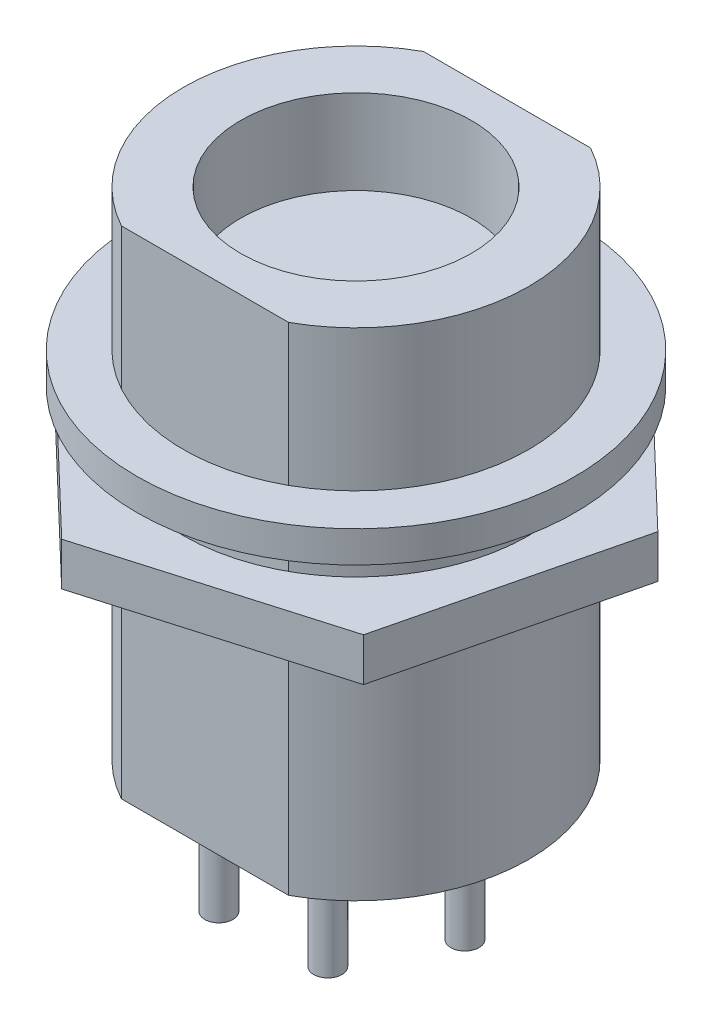
ISO-10303-21;
HEADER;
FILE_DESCRIPTION(('STEP AP214'),'2;1');
FILE_NAME('part.step','',(''),(''),'','','');
FILE_SCHEMA(('AUTOMOTIVE_DESIGN { 1 0 10303 214 1 1 1 1 }'));
ENDSEC;
DATA;
#1=APPLICATION_CONTEXT('core data for automotive mechanical design processes');
#2=APPLICATION_PROTOCOL_DEFINITION('international standard','automotive_design',2000,#1);
#3=PRODUCT_CONTEXT('',#1,'mechanical');
#4=PRODUCT('Part','Part','',(#3));
#5=PRODUCT_RELATED_PRODUCT_CATEGORY('part','',(#4));
#6=PRODUCT_DEFINITION_FORMATION('','',#4);
#7=PRODUCT_DEFINITION_CONTEXT('part definition',#1,'design');
#8=PRODUCT_DEFINITION('design','',#6,#7);
#9=PRODUCT_DEFINITION_SHAPE('','',#8);
#10=(LENGTH_UNIT() NAMED_UNIT(*) SI_UNIT(.MILLI.,.METRE.));
#11=(NAMED_UNIT(*) PLANE_ANGLE_UNIT() SI_UNIT($,.RADIAN.));
#12=(NAMED_UNIT(*) SI_UNIT($,.STERADIAN.) SOLID_ANGLE_UNIT());
#13=UNCERTAINTY_MEASURE_WITH_UNIT(LENGTH_MEASURE(1.E-05),#10,'distance_accuracy_value','');
#14=(GEOMETRIC_REPRESENTATION_CONTEXT(3) GLOBAL_UNCERTAINTY_ASSIGNED_CONTEXT((#13)) GLOBAL_UNIT_ASSIGNED_CONTEXT((#10,
#11,#12)) REPRESENTATION_CONTEXT('',''));
#15=CARTESIAN_POINT('',(0.,0.,0.));
#16=DIRECTION('',(0.,0.,1.));
#17=DIRECTION('',(1.,0.,0.));
#18=AXIS2_PLACEMENT_3D('',#15,#16,#17);
#19=CARTESIAN_POINT('',(8.15128443568329,-12.,7.80182063488103));
#20=DIRECTION('',(0.971362405785341,0.,0.237602770663379));
#21=DIRECTION('',(0.237602770663379,0.,-0.971362405785341));
#22=AXIS2_PLACEMENT_3D('',#19,#20,#21);
#23=PLANE('',#22);
#24=DIRECTION('',(0.237602770663379,0.,-0.971362405785341));
#25=VECTOR('',#24,1.);
#26=CARTESIAN_POINT('',(8.15128443568329,-10.,7.80182063488103));
#27=LINE('',#26,#25);
#28=CARTESIAN_POINT('',(8.15128443568329,-10.,7.80182063488103));
#29=VERTEX_POINT('',#28);
#30=CARTESIAN_POINT('',(10.8322170834183,-10.,-3.15830907733392));
#31=VERTEX_POINT('',#30);
#32=EDGE_CURVE('E132',#29,#31,#27,.T.);
#33=ORIENTED_EDGE('',*,*,#32,.F.);
#34=DIRECTION('',(0.,1.,0.));
#35=VECTOR('',#34,1.);
#36=CARTESIAN_POINT('',(8.15128443568329,-12.,7.80182063488103));
#37=LINE('',#36,#35);
#38=CARTESIAN_POINT('',(8.15128443568329,-12.,7.80182063488103));
#39=VERTEX_POINT('',#38);
#40=EDGE_CURVE('E12',#39,#29,#37,.T.);
#41=ORIENTED_EDGE('',*,*,#40,.F.);
#42=DIRECTION('',(0.237602770663379,0.,-0.971362405785341));
#43=VECTOR('',#42,1.);
#44=CARTESIAN_POINT('',(8.15128443568329,-12.,7.80182063488103));
#45=LINE('',#44,#43);
#46=CARTESIAN_POINT('',(10.8322170834183,-12.,-3.15830907733392));
#47=VERTEX_POINT('',#46);
#48=EDGE_CURVE('E147',#39,#47,#45,.T.);
#49=ORIENTED_EDGE('',*,*,#48,.T.);
#50=DIRECTION('',(0.,1.,0.));
#51=VECTOR('',#50,1.);
#52=CARTESIAN_POINT('',(10.8322170834183,-12.,-3.15830907733392));
#53=LINE('',#52,#51);
#54=EDGE_CURVE('E48',#47,#31,#53,.T.);
#55=ORIENTED_EDGE('',*,*,#54,.T.);
#56=EDGE_LOOP('',(#33,#41,#49,#55));
#57=FACE_BOUND('',#56,.T.);
#58=ADVANCED_FACE('F45',(#57),#23,.T.);
#59=CARTESIAN_POINT('',(-2.68093264773496,-12.,10.9601297122149));
#60=DIRECTION('',(0.279911167488616,0.,0.960025905022963));
#61=DIRECTION('',(0.960025905022963,0.,-0.279911167488616));
#62=AXIS2_PLACEMENT_3D('',#59,#60,#61);
#63=PLANE('',#62);
#64=DIRECTION('',(0.960025905022963,0.,-0.279911167488616));
#65=VECTOR('',#64,1.);
#66=CARTESIAN_POINT('',(-2.68093264773496,-10.,10.9601297122149));
#67=LINE('',#66,#65);
#68=CARTESIAN_POINT('',(-2.68093264773496,-10.,10.9601297122149));
#69=VERTEX_POINT('',#68);
#70=EDGE_CURVE('E145',#69,#29,#67,.T.);
#71=ORIENTED_EDGE('',*,*,#70,.F.);
#72=DIRECTION('',(0.,1.,0.));
#73=VECTOR('',#72,1.);
#74=CARTESIAN_POINT('',(-2.68093264773496,-12.,10.9601297122149));
#75=LINE('',#74,#73);
#76=CARTESIAN_POINT('',(-2.68093264773496,-12.,10.9601297122149));
#77=VERTEX_POINT('',#76);
#78=EDGE_CURVE('E54',#77,#69,#75,.T.);
#79=ORIENTED_EDGE('',*,*,#78,.F.);
#80=DIRECTION('',(0.960025905022963,0.,-0.279911167488616));
#81=VECTOR('',#80,1.);
#82=CARTESIAN_POINT('',(-2.68093264773496,-12.,10.9601297122149));
#83=LINE('',#82,#81);
#84=EDGE_CURVE('E120',#77,#39,#83,.T.);
#85=ORIENTED_EDGE('',*,*,#84,.T.);
#86=ORIENTED_EDGE('',*,*,#40,.T.);
#87=EDGE_LOOP('',(#71,#79,#85,#86));
#88=FACE_BOUND('',#87,.T.);
#89=ADVANCED_FACE('F155',(#88),#63,.T.);
#90=CARTESIAN_POINT('',(-10.8322170834183,-12.,3.15830907733392));
#91=DIRECTION('',(-0.691451238296725,0.,0.722423134359584));
#92=DIRECTION('',(0.722423134359584,0.,0.691451238296725));
#93=AXIS2_PLACEMENT_3D('',#90,#91,#92);
#94=PLANE('',#93);
#95=DIRECTION('',(0.722423134359584,0.,0.691451238296725));
#96=VECTOR('',#95,1.);
#97=CARTESIAN_POINT('',(-10.8322170834183,-10.,3.15830907733392));
#98=LINE('',#97,#96);
#99=CARTESIAN_POINT('',(-10.8322170834183,-10.,3.15830907733392));
#100=VERTEX_POINT('',#99);
#101=EDGE_CURVE('E107',#100,#69,#98,.T.);
#102=ORIENTED_EDGE('',*,*,#101,.F.);
#103=DIRECTION('',(0.,1.,0.));
#104=VECTOR('',#103,1.);
#105=CARTESIAN_POINT('',(-10.8322170834183,-12.,3.15830907733392));
#106=LINE('',#105,#104);
#107=CARTESIAN_POINT('',(-10.8322170834183,-12.,3.15830907733392));
#108=VERTEX_POINT('',#107);
#109=EDGE_CURVE('E102',#108,#100,#106,.T.);
#110=ORIENTED_EDGE('',*,*,#109,.F.);
#111=DIRECTION('',(0.722423134359584,0.,0.691451238296725));
#112=VECTOR('',#111,1.);
#113=CARTESIAN_POINT('',(-10.8322170834183,-12.,3.15830907733392));
#114=LINE('',#113,#112);
#115=EDGE_CURVE('E105',#108,#77,#114,.T.);
#116=ORIENTED_EDGE('',*,*,#115,.T.);
#117=ORIENTED_EDGE('',*,*,#78,.T.);
#118=EDGE_LOOP('',(#102,#110,#116,#117));
#119=FACE_BOUND('',#118,.T.);
#120=ADVANCED_FACE('F104',(#119),#94,.T.);
#121=CARTESIAN_POINT('',(-8.15128443568329,-12.,-7.80182063488103));
#122=DIRECTION('',(-0.971362405785341,0.,-0.237602770663379));
#123=DIRECTION('',(-0.237602770663379,0.,0.971362405785341));
#124=AXIS2_PLACEMENT_3D('',#121,#122,#123);
#125=PLANE('',#124);
#126=DIRECTION('',(-0.237602770663379,0.,0.971362405785341));
#127=VECTOR('',#126,1.);
#128=CARTESIAN_POINT('',(-8.15128443568329,-10.,-7.80182063488103));
#129=LINE('',#128,#127);
#130=CARTESIAN_POINT('',(-8.15128443568329,-10.,-7.80182063488103));
#131=VERTEX_POINT('',#130);
#132=EDGE_CURVE('E142',#131,#100,#129,.T.);
#133=ORIENTED_EDGE('',*,*,#132,.F.);
#134=DIRECTION('',(0.,1.,0.));
#135=VECTOR('',#134,1.);
#136=CARTESIAN_POINT('',(-8.15128443568329,-12.,-7.80182063488103));
#137=LINE('',#136,#135);
#138=CARTESIAN_POINT('',(-8.15128443568329,-12.,-7.80182063488103));
#139=VERTEX_POINT('',#138);
#140=EDGE_CURVE('E112',#139,#131,#137,.T.);
#141=ORIENTED_EDGE('',*,*,#140,.F.);
#142=DIRECTION('',(-0.237602770663379,0.,0.971362405785341));
#143=VECTOR('',#142,1.);
#144=CARTESIAN_POINT('',(-8.15128443568329,-12.,-7.80182063488103));
#145=LINE('',#144,#143);
#146=EDGE_CURVE('E118',#139,#108,#145,.T.);
#147=ORIENTED_EDGE('',*,*,#146,.T.);
#148=ORIENTED_EDGE('',*,*,#109,.T.);
#149=EDGE_LOOP('',(#133,#141,#147,#148));
#150=FACE_BOUND('',#149,.T.);
#151=ADVANCED_FACE('F122',(#150),#125,.T.);
#152=CARTESIAN_POINT('',(2.68093264773497,-12.,-10.9601297122149));
#153=DIRECTION('',(-0.279911167488616,0.,-0.960025905022963));
#154=DIRECTION('',(-0.960025905022963,0.,0.279911167488616));
#155=AXIS2_PLACEMENT_3D('',#152,#153,#154);
#156=PLANE('',#155);
#157=DIRECTION('',(-0.960025905022963,0.,0.279911167488616));
#158=VECTOR('',#157,1.);
#159=CARTESIAN_POINT('',(2.68093264773497,-10.,-10.9601297122149));
#160=LINE('',#159,#158);
#161=CARTESIAN_POINT('',(2.68093264773497,-10.,-10.9601297122149));
#162=VERTEX_POINT('',#161);
#163=EDGE_CURVE('E139',#162,#131,#160,.T.);
#164=ORIENTED_EDGE('',*,*,#163,.F.);
#165=DIRECTION('',(0.,1.,0.));
#166=VECTOR('',#165,1.);
#167=CARTESIAN_POINT('',(2.68093264773497,-12.,-10.9601297122149));
#168=LINE('',#167,#166);
#169=CARTESIAN_POINT('',(2.68093264773497,-12.,-10.9601297122149));
#170=VERTEX_POINT('',#169);
#171=EDGE_CURVE('E150',#170,#162,#168,.T.);
#172=ORIENTED_EDGE('',*,*,#171,.F.);
#173=DIRECTION('',(-0.960025905022963,0.,0.279911167488616));
#174=VECTOR('',#173,1.);
#175=CARTESIAN_POINT('',(2.68093264773497,-12.,-10.9601297122149));
#176=LINE('',#175,#174);
#177=EDGE_CURVE('E124',#170,#139,#176,.T.);
#178=ORIENTED_EDGE('',*,*,#177,.T.);
#179=ORIENTED_EDGE('',*,*,#140,.T.);
#180=EDGE_LOOP('',(#164,#172,#178,#179));
#181=FACE_BOUND('',#180,.T.);
#182=ADVANCED_FACE('F168',(#181),#156,.T.);
#183=CARTESIAN_POINT('',(10.8322170834183,-12.,-3.15830907733392));
#184=DIRECTION('',(0.691451238296725,0.,-0.722423134359584));
#185=DIRECTION('',(-0.722423134359584,0.,-0.691451238296725));
#186=AXIS2_PLACEMENT_3D('',#183,#184,#185);
#187=PLANE('',#186);
#188=DIRECTION('',(-0.722423134359584,0.,-0.691451238296725));
#189=VECTOR('',#188,1.);
#190=CARTESIAN_POINT('',(10.8322170834183,-10.,-3.15830907733392));
#191=LINE('',#190,#189);
#192=EDGE_CURVE('E135',#31,#162,#191,.T.);
#193=ORIENTED_EDGE('',*,*,#192,.F.);
#194=ORIENTED_EDGE('',*,*,#54,.F.);
#195=DIRECTION('',(-0.722423134359584,0.,-0.691451238296725));
#196=VECTOR('',#195,1.);
#197=CARTESIAN_POINT('',(10.8322170834183,-12.,-3.15830907733392));
#198=LINE('',#197,#196);
#199=EDGE_CURVE('E127',#47,#170,#198,.T.);
#200=ORIENTED_EDGE('',*,*,#199,.T.);
#201=ORIENTED_EDGE('',*,*,#171,.T.);
#202=EDGE_LOOP('',(#193,#194,#200,#201));
#203=FACE_BOUND('',#202,.T.);
#204=ADVANCED_FACE('F152',(#203),#187,.T.);
#205=CARTESIAN_POINT('',(0.,-12.,0.));
#206=DIRECTION('',(0.,1.,0.));
#207=DIRECTION('',(0.,0.,1.));
#208=AXIS2_PLACEMENT_3D('',#205,#206,#207);
#209=PLANE('',#208);
#210=CARTESIAN_POINT('',(0.,-12.,0.));
#211=DIRECTION('',(0.,1.,0.));
#212=DIRECTION('',(0.,0.,1.));
#213=AXIS2_PLACEMENT_3D('',#210,#211,#212);
#214=CIRCLE('',#213,8.);
#215=CARTESIAN_POINT('',(0.,-12.,8.));
#216=VERTEX_POINT('',#215);
#217=EDGE_CURVE('E136',#216,#216,#214,.T.);
#218=ORIENTED_EDGE('',*,*,#217,.T.);
#219=EDGE_LOOP('',(#218));
#220=FACE_BOUND('',#219,.T.);
#221=ORIENTED_EDGE('',*,*,#48,.F.);
#222=ORIENTED_EDGE('',*,*,#84,.F.);
#223=ORIENTED_EDGE('',*,*,#115,.F.);
#224=ORIENTED_EDGE('',*,*,#146,.F.);
#225=ORIENTED_EDGE('',*,*,#177,.F.);
#226=ORIENTED_EDGE('',*,*,#199,.F.);
#227=EDGE_LOOP('',(#221,#222,#223,#224,#225,#226));
#228=FACE_BOUND('',#227,.T.);
#229=ADVANCED_FACE('F116',(#220,#228),#209,.F.);
#230=CARTESIAN_POINT('',(0.,-10.,0.));
#231=DIRECTION('',(0.,1.,0.));
#232=DIRECTION('',(0.,0.,1.));
#233=AXIS2_PLACEMENT_3D('',#230,#231,#232);
#234=PLANE('',#233);
#235=CARTESIAN_POINT('',(0.,-10.,0.));
#236=DIRECTION('',(0.,1.,0.));
#237=DIRECTION('',(0.,0.,1.));
#238=AXIS2_PLACEMENT_3D('',#235,#236,#237);
#239=CIRCLE('',#238,8.);
#240=CARTESIAN_POINT('',(0.,-10.,8.));
#241=VERTEX_POINT('',#240);
#242=EDGE_CURVE('E191',#241,#241,#239,.T.);
#243=ORIENTED_EDGE('',*,*,#242,.F.);
#244=EDGE_LOOP('',(#243));
#245=FACE_BOUND('',#244,.T.);
#246=ORIENTED_EDGE('',*,*,#32,.T.);
#247=ORIENTED_EDGE('',*,*,#192,.T.);
#248=ORIENTED_EDGE('',*,*,#163,.T.);
#249=ORIENTED_EDGE('',*,*,#132,.T.);
#250=ORIENTED_EDGE('',*,*,#101,.T.);
#251=ORIENTED_EDGE('',*,*,#70,.T.);
#252=EDGE_LOOP('',(#246,#247,#248,#249,#250,#251));
#253=FACE_BOUND('',#252,.T.);
#254=ADVANCED_FACE('F154',(#245,#253),#234,.T.);
#255=CARTESIAN_POINT('',(0.,-12.,0.));
#256=DIRECTION('',(0.,1.,0.));
#257=DIRECTION('',(0.,0.,1.));
#258=AXIS2_PLACEMENT_3D('',#255,#256,#257);
#259=CYLINDRICAL_SURFACE('',#258,8.);
#260=ORIENTED_EDGE('',*,*,#217,.F.);
#261=EDGE_LOOP('',(#260));
#262=FACE_BOUND('',#261,.T.);
#263=ORIENTED_EDGE('',*,*,#242,.T.);
#264=EDGE_LOOP('',(#263));
#265=FACE_BOUND('',#264,.T.);
#266=ADVANCED_FACE('F179',(#262,#265),#259,.F.);
#267=CLOSED_SHELL('',(#58,#89,#120,#151,#182,#204,#229,#254,#266));
#268=MANIFOLD_SOLID_BREP('B2',#267);
#269=CARTESIAN_POINT('',(0.,0.,0.));
#270=DIRECTION('',(0.,-1.,0.));
#271=DIRECTION('',(0.,0.,-1.));
#272=AXIS2_PLACEMENT_3D('',#269,#270,#271);
#273=CYLINDRICAL_SURFACE('',#272,10.1527371252182);
#274=CARTESIAN_POINT('',(0.,-8.,0.));
#275=DIRECTION('',(0.,-1.,0.));
#276=DIRECTION('',(0.,0.,-1.));
#277=AXIS2_PLACEMENT_3D('',#274,#275,#276);
#278=CIRCLE('',#277,10.1527371252182);
#279=CARTESIAN_POINT('',(0.,-8.,-10.1527371252182));
#280=VERTEX_POINT('',#279);
#281=EDGE_CURVE('E44',#280,#280,#278,.T.);
#282=ORIENTED_EDGE('',*,*,#281,.F.);
#283=EDGE_LOOP('',(#282));
#284=FACE_BOUND('',#283,.T.);
#285=CARTESIAN_POINT('',(0.,-6.54412226680342,0.));
#286=DIRECTION('',(0.,-1.,0.));
#287=DIRECTION('',(0.,0.,-1.));
#288=AXIS2_PLACEMENT_3D('',#285,#286,#287);
#289=CIRCLE('',#288,10.1527371252182);
#290=CARTESIAN_POINT('',(0.,-6.54412226680342,-10.1527371252182));
#291=VERTEX_POINT('',#290);
#292=EDGE_CURVE('E266',#291,#291,#289,.T.);
#293=ORIENTED_EDGE('',*,*,#292,.T.);
#294=EDGE_LOOP('',(#293));
#295=FACE_BOUND('',#294,.T.);
#296=ADVANCED_FACE('F252',(#284,#295),#273,.T.);
#297=CARTESIAN_POINT('',(-10.1527371252182,-8.,0.));
#298=DIRECTION('',(0.,1.,0.));
#299=DIRECTION('',(0.,0.,1.));
#300=AXIS2_PLACEMENT_3D('',#297,#298,#299);
#301=PLANE('',#300);
#302=CARTESIAN_POINT('',(0.,-8.,0.));
#303=DIRECTION('',(0.,-1.,0.));
#304=DIRECTION('',(0.,0.,-1.));
#305=AXIS2_PLACEMENT_3D('',#302,#303,#304);
#306=CIRCLE('',#305,8.);
#307=CARTESIAN_POINT('',(0.,-8.,-8.));
#308=VERTEX_POINT('',#307);
#309=EDGE_CURVE('E258',#308,#308,#306,.T.);
#310=ORIENTED_EDGE('',*,*,#309,.F.);
#311=EDGE_LOOP('',(#310));
#312=FACE_BOUND('',#311,.T.);
#313=ORIENTED_EDGE('',*,*,#281,.T.);
#314=EDGE_LOOP('',(#313));
#315=FACE_BOUND('',#314,.T.);
#316=ADVANCED_FACE('F281',(#312,#315),#301,.F.);
#317=CARTESIAN_POINT('',(0.,0.,0.));
#318=DIRECTION('',(0.,-1.,0.));
#319=DIRECTION('',(0.,0.,-1.));
#320=AXIS2_PLACEMENT_3D('',#317,#318,#319);
#321=CYLINDRICAL_SURFACE('',#320,8.);
#322=CARTESIAN_POINT('',(0.,-6.54412226680342,0.));
#323=DIRECTION('',(0.,-1.,0.));
#324=DIRECTION('',(0.,0.,-1.));
#325=AXIS2_PLACEMENT_3D('',#322,#323,#324);
#326=CIRCLE('',#325,8.);
#327=CARTESIAN_POINT('',(0.,-6.54412226680342,-8.));
#328=VERTEX_POINT('',#327);
#329=EDGE_CURVE('E262',#328,#328,#326,.T.);
#330=ORIENTED_EDGE('',*,*,#329,.F.);
#331=EDGE_LOOP('',(#330));
#332=FACE_BOUND('',#331,.T.);
#333=ORIENTED_EDGE('',*,*,#309,.T.);
#334=EDGE_LOOP('',(#333));
#335=FACE_BOUND('',#334,.T.);
#336=ADVANCED_FACE('F276',(#332,#335),#321,.F.);
#337=CARTESIAN_POINT('',(-10.1527371252182,-6.54412226680342,0.));
#338=DIRECTION('',(0.,-1.,0.));
#339=DIRECTION('',(0.,0.,-1.));
#340=AXIS2_PLACEMENT_3D('',#337,#338,#339);
#341=PLANE('',#340);
#342=ORIENTED_EDGE('',*,*,#292,.F.);
#343=EDGE_LOOP('',(#342));
#344=FACE_BOUND('',#343,.T.);
#345=ORIENTED_EDGE('',*,*,#329,.T.);
#346=EDGE_LOOP('',(#345));
#347=FACE_BOUND('',#346,.T.);
#348=ADVANCED_FACE('F273',(#344,#347),#341,.F.);
#349=CLOSED_SHELL('',(#296,#316,#336,#348));
#350=MANIFOLD_SOLID_BREP('B6',#349);
#351=CARTESIAN_POINT('',(0.,0.,0.));
#352=DIRECTION('',(0.,1.,0.));
#353=DIRECTION('',(0.,0.,1.));
#354=AXIS2_PLACEMENT_3D('',#351,#352,#353);
#355=CYLINDRICAL_SURFACE('',#354,8.);
#356=CARTESIAN_POINT('',(0.,0.,0.));
#357=DIRECTION('',(0.,1.,0.));
#358=DIRECTION('',(0.,0.,1.));
#359=AXIS2_PLACEMENT_3D('',#356,#357,#358);
#360=CIRCLE('',#359,8.);
#361=CARTESIAN_POINT('',(3.87298334620741,0.,7.));
#362=VERTEX_POINT('',#361);
#363=CARTESIAN_POINT('',(3.87298334620741,0.,-7.));
#364=VERTEX_POINT('',#363);
#365=EDGE_CURVE('E367',#362,#364,#360,.T.);
#366=ORIENTED_EDGE('',*,*,#365,.F.);
#367=DIRECTION('',(0.,1.,0.));
#368=VECTOR('',#367,1.);
#369=CARTESIAN_POINT('',(3.87298334620741,0.,7.));
#370=LINE('',#369,#368);
#371=CARTESIAN_POINT('',(3.87298334620741,-23.,7.));
#372=VERTEX_POINT('',#371);
#373=EDGE_CURVE('E384',#362,#372,#370,.F.);
#374=ORIENTED_EDGE('',*,*,#373,.T.);
#375=CARTESIAN_POINT('',(0.,-23.,0.));
#376=DIRECTION('',(0.,1.,0.));
#377=DIRECTION('',(0.,0.,1.));
#378=AXIS2_PLACEMENT_3D('',#375,#376,#377);
#379=CIRCLE('',#378,8.);
#380=CARTESIAN_POINT('',(3.87298334620741,-23.,-7.));
#381=VERTEX_POINT('',#380);
#382=EDGE_CURVE('E369',#372,#381,#379,.T.);
#383=ORIENTED_EDGE('',*,*,#382,.T.);
#384=DIRECTION('',(0.,1.,0.));
#385=VECTOR('',#384,1.);
#386=CARTESIAN_POINT('',(3.87298334620741,0.,-7.));
#387=LINE('',#386,#385);
#388=EDGE_CURVE('E336',#381,#364,#387,.T.);
#389=ORIENTED_EDGE('',*,*,#388,.T.);
#390=EDGE_LOOP('',(#366,#374,#383,#389));
#391=FACE_BOUND('',#390,.T.);
#392=ADVANCED_FACE('F315',(#391),#355,.T.);
#393=CARTESIAN_POINT('',(-3.87298334620741,-23.,-7.));
#394=VERTEX_POINT('',#393);
#395=CARTESIAN_POINT('',(-3.87298334620741,-23.,7.));
#396=VERTEX_POINT('',#395);
#397=EDGE_CURVE('E383',#394,#396,#379,.T.);
#398=ORIENTED_EDGE('',*,*,#397,.T.);
#399=DIRECTION('',(0.,1.,0.));
#400=VECTOR('',#399,1.);
#401=CARTESIAN_POINT('',(-3.87298334620741,0.,7.));
#402=LINE('',#401,#400);
#403=CARTESIAN_POINT('',(-3.87298334620741,0.,7.));
#404=VERTEX_POINT('',#403);
#405=EDGE_CURVE('E329',#396,#404,#402,.T.);
#406=ORIENTED_EDGE('',*,*,#405,.T.);
#407=CARTESIAN_POINT('',(-3.87298334620741,0.,-7.));
#408=VERTEX_POINT('',#407);
#409=EDGE_CURVE('E373',#408,#404,#360,.T.);
#410=ORIENTED_EDGE('',*,*,#409,.F.);
#411=DIRECTION('',(0.,1.,0.));
#412=VECTOR('',#411,1.);
#413=CARTESIAN_POINT('',(-3.87298334620741,0.,-7.));
#414=LINE('',#413,#412);
#415=EDGE_CURVE('E355',#408,#394,#414,.F.);
#416=ORIENTED_EDGE('',*,*,#415,.T.);
#417=EDGE_LOOP('',(#398,#406,#410,#416));
#418=FACE_BOUND('',#417,.T.);
#419=ADVANCED_FACE('F452',(#418),#355,.T.);
#420=CARTESIAN_POINT('',(-8.,0.,0.));
#421=DIRECTION('',(0.,1.,0.));
#422=DIRECTION('',(0.,0.,1.));
#423=AXIS2_PLACEMENT_3D('',#420,#421,#422);
#424=PLANE('',#423);
#425=CARTESIAN_POINT('',(0.,0.,0.));
#426=DIRECTION('',(0.,1.,0.));
#427=DIRECTION('',(0.,0.,1.));
#428=AXIS2_PLACEMENT_3D('',#425,#426,#427);
#429=CIRCLE('',#428,5.34513274336283);
#430=CARTESIAN_POINT('',(0.,0.,5.34513274336283));
#431=VERTEX_POINT('',#430);
#432=EDGE_CURVE('E375',#431,#431,#429,.T.);
#433=ORIENTED_EDGE('',*,*,#432,.F.);
#434=EDGE_LOOP('',(#433));
#435=FACE_BOUND('',#434,.T.);
#436=ORIENTED_EDGE('',*,*,#409,.T.);
#437=DIRECTION('',(1.,0.,0.));
#438=VECTOR('',#437,1.);
#439=CARTESIAN_POINT('',(-13.3172905902933,0.,7.));
#440=LINE('',#439,#438);
#441=EDGE_CURVE('E360',#404,#362,#440,.T.);
#442=ORIENTED_EDGE('',*,*,#441,.T.);
#443=ORIENTED_EDGE('',*,*,#365,.T.);
#444=DIRECTION('',(-1.,0.,0.));
#445=VECTOR('',#444,1.);
#446=CARTESIAN_POINT('',(-13.3172905902933,0.,-7.));
#447=LINE('',#446,#445);
#448=EDGE_CURVE('E352',#364,#408,#447,.T.);
#449=ORIENTED_EDGE('',*,*,#448,.T.);
#450=EDGE_LOOP('',(#436,#442,#443,#449));
#451=FACE_BOUND('',#450,.T.);
#452=ADVANCED_FACE('F372',(#435,#451),#424,.T.);
#453=CARTESIAN_POINT('',(0.,-23.,0.));
#454=DIRECTION('',(0.,-1.,0.));
#455=DIRECTION('',(0.,0.,-1.));
#456=AXIS2_PLACEMENT_3D('',#453,#454,#455);
#457=PLANE('',#456);
#458=CARTESIAN_POINT('',(-2.09604377673175,-23.,4.25794078572056));
#459=DIRECTION('',(0.,-1.,0.));
#460=DIRECTION('',(0.866025403784433,0.,-0.50000000000001));
#461=AXIS2_PLACEMENT_3D('',#458,#459,#460);
#462=CIRCLE('',#461,0.653357701359126);
#463=CARTESIAN_POINT('',(-1.53021940959654,-23.,3.93126193504099));
#464=VERTEX_POINT('',#463);
#465=EDGE_CURVE('E419',#464,#464,#462,.T.);
#466=ORIENTED_EDGE('',*,*,#465,.F.);
#467=EDGE_LOOP('',(#466));
#468=FACE_BOUND('',#467,.T.);
#469=CARTESIAN_POINT('',(-4.73550677660975,-23.,0.313743234766293));
#470=DIRECTION('',(0.,-1.,0.));
#471=DIRECTION('',(0.866025403784443,0.,0.499999999999992));
#472=AXIS2_PLACEMENT_3D('',#469,#470,#471);
#473=CIRCLE('',#472,0.653357701359126);
#474=CARTESIAN_POINT('',(-4.16968240947454,-23.,0.640422085445851));
#475=VERTEX_POINT('',#474);
#476=EDGE_CURVE('E413',#475,#475,#473,.T.);
#477=ORIENTED_EDGE('',*,*,#476,.F.);
#478=EDGE_LOOP('',(#477));
#479=FACE_BOUND('',#478,.T.);
#480=CARTESIAN_POINT('',(-2.63946299987795,-23.,-3.94419755095428));
#481=DIRECTION('',(0.,-1.,0.));
#482=DIRECTION('',(0.,0.,1.));
#483=AXIS2_PLACEMENT_3D('',#480,#481,#482);
#484=CIRCLE('',#483,0.653357701359126);
#485=CARTESIAN_POINT('',(-2.63946299987795,-23.,-3.29083984959516));
#486=VERTEX_POINT('',#485);
#487=EDGE_CURVE('E407',#486,#486,#484,.T.);
#488=ORIENTED_EDGE('',*,*,#487,.F.);
#489=EDGE_LOOP('',(#488));
#490=FACE_BOUND('',#489,.T.);
#491=CARTESIAN_POINT('',(2.09604377673178,-23.,-4.25794078572054));
#492=DIRECTION('',(0.,-1.,0.));
#493=DIRECTION('',(-0.866025403784436,0.,0.500000000000004));
#494=AXIS2_PLACEMENT_3D('',#491,#492,#493);
#495=CIRCLE('',#494,0.653357701359126);
#496=CARTESIAN_POINT('',(1.53021940959657,-23.,-3.93126193504098));
#497=VERTEX_POINT('',#496);
#498=EDGE_CURVE('E401',#497,#497,#495,.T.);
#499=ORIENTED_EDGE('',*,*,#498,.F.);
#500=EDGE_LOOP('',(#499));
#501=FACE_BOUND('',#500,.T.);
#502=CARTESIAN_POINT('',(4.73550677660975,-23.,-0.31374323476626));
#503=DIRECTION('',(0.,-1.,0.));
#504=DIRECTION('',(-0.86602540378444,0.,-0.499999999999998));
#505=AXIS2_PLACEMENT_3D('',#502,#503,#504);
#506=CIRCLE('',#505,0.653357701359126);
#507=CARTESIAN_POINT('',(4.16968240947454,-23.,-0.640422085445822));
#508=VERTEX_POINT('',#507);
#509=EDGE_CURVE('E395',#508,#508,#506,.T.);
#510=ORIENTED_EDGE('',*,*,#509,.F.);
#511=EDGE_LOOP('',(#510));
#512=FACE_BOUND('',#511,.T.);
#513=CARTESIAN_POINT('',(2.63946299987795,-23.,3.94419755095428));
#514=DIRECTION('',(0.,-1.,0.));
#515=DIRECTION('',(0.,0.,-1.));
#516=AXIS2_PLACEMENT_3D('',#513,#514,#515);
#517=CIRCLE('',#516,0.653357701359126);
#518=CARTESIAN_POINT('',(2.63946299987795,-23.,3.29083984959516));
#519=VERTEX_POINT('',#518);
#520=EDGE_CURVE('E389',#519,#519,#517,.T.);
#521=ORIENTED_EDGE('',*,*,#520,.F.);
#522=EDGE_LOOP('',(#521));
#523=FACE_BOUND('',#522,.T.);
#524=ORIENTED_EDGE('',*,*,#382,.F.);
#525=DIRECTION('',(-1.,0.,0.));
#526=VECTOR('',#525,1.);
#527=CARTESIAN_POINT('',(0.,-23.,7.));
#528=LINE('',#527,#526);
#529=EDGE_CURVE('E250',#372,#396,#528,.T.);
#530=ORIENTED_EDGE('',*,*,#529,.T.);
#531=ORIENTED_EDGE('',*,*,#397,.F.);
#532=DIRECTION('',(1.,0.,0.));
#533=VECTOR('',#532,1.);
#534=CARTESIAN_POINT('',(0.,-23.,-7.));
#535=LINE('',#534,#533);
#536=EDGE_CURVE('E322',#394,#381,#535,.T.);
#537=ORIENTED_EDGE('',*,*,#536,.T.);
#538=EDGE_LOOP('',(#524,#530,#531,#537));
#539=FACE_BOUND('',#538,.T.);
#540=ADVANCED_FACE('F434',(#468,#479,#490,#501,#512,#523,#539),#457,.T.);
#541=CARTESIAN_POINT('',(0.,0.,0.));
#542=DIRECTION('',(0.,1.,0.));
#543=DIRECTION('',(0.,0.,1.));
#544=AXIS2_PLACEMENT_3D('',#541,#542,#543);
#545=CYLINDRICAL_SURFACE('',#544,5.34513274336283);
#546=ORIENTED_EDGE('',*,*,#432,.T.);
#547=EDGE_LOOP('',(#546));
#548=FACE_BOUND('',#547,.T.);
#549=CARTESIAN_POINT('',(0.,-3.92424753581476,0.));
#550=DIRECTION('',(0.,1.,0.));
#551=DIRECTION('',(0.,0.,1.));
#552=AXIS2_PLACEMENT_3D('',#549,#550,#551);
#553=CIRCLE('',#552,5.34513274336283);
#554=CARTESIAN_POINT('',(0.,-3.92424753581476,5.34513274336283));
#555=VERTEX_POINT('',#554);
#556=EDGE_CURVE('E379',#555,#555,#553,.T.);
#557=ORIENTED_EDGE('',*,*,#556,.F.);
#558=EDGE_LOOP('',(#557));
#559=FACE_BOUND('',#558,.T.);
#560=ADVANCED_FACE('F437',(#548,#559),#545,.F.);
#561=CARTESIAN_POINT('',(-5.34513274336283,-3.92424753581422,0.));
#562=DIRECTION('',(0.,1.,0.));
#563=DIRECTION('',(0.,0.,1.));
#564=AXIS2_PLACEMENT_3D('',#561,#562,#563);
#565=PLANE('',#564);
#566=ORIENTED_EDGE('',*,*,#556,.T.);
#567=EDGE_LOOP('',(#566));
#568=FACE_BOUND('',#567,.T.);
#569=ADVANCED_FACE('F483',(#568),#565,.T.);
#570=CARTESIAN_POINT('',(-13.3172905902933,-23.,-7.));
#571=DIRECTION('',(0.,0.,-1.));
#572=DIRECTION('',(-1.,0.,0.));
#573=AXIS2_PLACEMENT_3D('',#570,#571,#572);
#574=PLANE('',#573);
#575=ORIENTED_EDGE('',*,*,#448,.F.);
#576=ORIENTED_EDGE('',*,*,#388,.F.);
#577=ORIENTED_EDGE('',*,*,#536,.F.);
#578=ORIENTED_EDGE('',*,*,#415,.F.);
#579=EDGE_LOOP('',(#575,#576,#577,#578));
#580=FACE_BOUND('',#579,.T.);
#581=ADVANCED_FACE('F353',(#580),#574,.T.);
#582=CARTESIAN_POINT('',(-13.3172905902933,-23.,7.));
#583=DIRECTION('',(0.,0.,1.));
#584=DIRECTION('',(1.,0.,0.));
#585=AXIS2_PLACEMENT_3D('',#582,#583,#584);
#586=PLANE('',#585);
#587=ORIENTED_EDGE('',*,*,#441,.F.);
#588=ORIENTED_EDGE('',*,*,#405,.F.);
#589=ORIENTED_EDGE('',*,*,#529,.F.);
#590=ORIENTED_EDGE('',*,*,#373,.F.);
#591=EDGE_LOOP('',(#587,#588,#589,#590));
#592=FACE_BOUND('',#591,.T.);
#593=ADVANCED_FACE('F468',(#592),#586,.T.);
#594=CARTESIAN_POINT('',(2.63946299987795,-28.,3.94419755095428));
#595=DIRECTION('',(0.,1.,0.));
#596=DIRECTION('',(0.,0.,1.));
#597=AXIS2_PLACEMENT_3D('',#594,#595,#596);
#598=CYLINDRICAL_SURFACE('',#597,0.653357701359126);
#599=CARTESIAN_POINT('',(2.63946299987795,-28.,3.94419755095428));
#600=DIRECTION('',(0.,-1.,0.));
#601=DIRECTION('',(0.,0.,-1.));
#602=AXIS2_PLACEMENT_3D('',#599,#600,#601);
#603=CIRCLE('',#602,0.653357701359126);
#604=CARTESIAN_POINT('',(2.63946299987795,-28.,3.29083984959516));
#605=VERTEX_POINT('',#604);
#606=EDGE_CURVE('E361',#605,#605,#603,.T.);
#607=ORIENTED_EDGE('',*,*,#606,.F.);
#608=EDGE_LOOP('',(#607));
#609=FACE_BOUND('',#608,.T.);
#610=ORIENTED_EDGE('',*,*,#520,.T.);
#611=EDGE_LOOP('',(#610));
#612=FACE_BOUND('',#611,.T.);
#613=ADVANCED_FACE('F473',(#609,#612),#598,.T.);
#614=CARTESIAN_POINT('',(2.63946299987795,-28.,3.94419755095428));
#615=DIRECTION('',(0.,-1.,0.));
#616=DIRECTION('',(0.,0.,-1.));
#617=AXIS2_PLACEMENT_3D('',#614,#615,#616);
#618=PLANE('',#617);
#619=ORIENTED_EDGE('',*,*,#606,.T.);
#620=EDGE_LOOP('',(#619));
#621=FACE_BOUND('',#620,.T.);
#622=ADVANCED_FACE('F526',(#621),#618,.T.);
#623=CARTESIAN_POINT('',(4.73550677660975,-28.,-0.31374323476626));
#624=DIRECTION('',(0.,1.,0.));
#625=DIRECTION('',(0.,0.,1.));
#626=AXIS2_PLACEMENT_3D('',#623,#624,#625);
#627=CYLINDRICAL_SURFACE('',#626,0.653357701359126);
#628=CARTESIAN_POINT('',(4.73550677660975,-28.,-0.31374323476626));
#629=DIRECTION('',(0.,-1.,0.));
#630=DIRECTION('',(-0.86602540378444,0.,-0.499999999999998));
#631=AXIS2_PLACEMENT_3D('',#628,#629,#630);
#632=CIRCLE('',#631,0.653357701359126);
#633=CARTESIAN_POINT('',(4.16968240947454,-28.,-0.640422085445822));
#634=VERTEX_POINT('',#633);
#635=EDGE_CURVE('E392',#634,#634,#632,.T.);
#636=ORIENTED_EDGE('',*,*,#635,.F.);
#637=EDGE_LOOP('',(#636));
#638=FACE_BOUND('',#637,.T.);
#639=ORIENTED_EDGE('',*,*,#509,.T.);
#640=EDGE_LOOP('',(#639));
#641=FACE_BOUND('',#640,.T.);
#642=ADVANCED_FACE('F530',(#638,#641),#627,.T.);
#643=CARTESIAN_POINT('',(4.73550677660975,-28.,-0.31374323476626));
#644=DIRECTION('',(0.,-1.,0.));
#645=DIRECTION('',(-0.86602540378444,0.,-0.499999999999998));
#646=AXIS2_PLACEMENT_3D('',#643,#644,#645);
#647=PLANE('',#646);
#648=ORIENTED_EDGE('',*,*,#635,.T.);
#649=EDGE_LOOP('',(#648));
#650=FACE_BOUND('',#649,.T.);
#651=ADVANCED_FACE('F534',(#650),#647,.T.);
#652=CARTESIAN_POINT('',(2.09604377673178,-28.,-4.25794078572054));
#653=DIRECTION('',(0.,1.,0.));
#654=DIRECTION('',(0.,0.,1.));
#655=AXIS2_PLACEMENT_3D('',#652,#653,#654);
#656=CYLINDRICAL_SURFACE('',#655,0.653357701359126);
#657=CARTESIAN_POINT('',(2.09604377673178,-28.,-4.25794078572054));
#658=DIRECTION('',(0.,-1.,0.));
#659=DIRECTION('',(-0.866025403784436,0.,0.500000000000004));
#660=AXIS2_PLACEMENT_3D('',#657,#658,#659);
#661=CIRCLE('',#660,0.653357701359126);
#662=CARTESIAN_POINT('',(1.53021940959657,-28.,-3.93126193504098));
#663=VERTEX_POINT('',#662);
#664=EDGE_CURVE('E398',#663,#663,#661,.T.);
#665=ORIENTED_EDGE('',*,*,#664,.F.);
#666=EDGE_LOOP('',(#665));
#667=FACE_BOUND('',#666,.T.);
#668=ORIENTED_EDGE('',*,*,#498,.T.);
#669=EDGE_LOOP('',(#668));
#670=FACE_BOUND('',#669,.T.);
#671=ADVANCED_FACE('F538',(#667,#670),#656,.T.);
#672=CARTESIAN_POINT('',(2.09604377673178,-28.,-4.25794078572054));
#673=DIRECTION('',(0.,-1.,0.));
#674=DIRECTION('',(-0.866025403784436,0.,0.500000000000004));
#675=AXIS2_PLACEMENT_3D('',#672,#673,#674);
#676=PLANE('',#675);
#677=ORIENTED_EDGE('',*,*,#664,.T.);
#678=EDGE_LOOP('',(#677));
#679=FACE_BOUND('',#678,.T.);
#680=ADVANCED_FACE('F542',(#679),#676,.T.);
#681=CARTESIAN_POINT('',(-2.63946299987795,-28.,-3.94419755095428));
#682=DIRECTION('',(0.,1.,0.));
#683=DIRECTION('',(0.,0.,1.));
#684=AXIS2_PLACEMENT_3D('',#681,#682,#683);
#685=CYLINDRICAL_SURFACE('',#684,0.653357701359126);
#686=CARTESIAN_POINT('',(-2.63946299987795,-28.,-3.94419755095428));
#687=DIRECTION('',(0.,-1.,0.));
#688=DIRECTION('',(0.,0.,1.));
#689=AXIS2_PLACEMENT_3D('',#686,#687,#688);
#690=CIRCLE('',#689,0.653357701359126);
#691=CARTESIAN_POINT('',(-2.63946299987795,-28.,-3.29083984959516));
#692=VERTEX_POINT('',#691);
#693=EDGE_CURVE('E404',#692,#692,#690,.T.);
#694=ORIENTED_EDGE('',*,*,#693,.F.);
#695=EDGE_LOOP('',(#694));
#696=FACE_BOUND('',#695,.T.);
#697=ORIENTED_EDGE('',*,*,#487,.T.);
#698=EDGE_LOOP('',(#697));
#699=FACE_BOUND('',#698,.T.);
#700=ADVANCED_FACE('F546',(#696,#699),#685,.T.);
#701=CARTESIAN_POINT('',(-2.63946299987795,-28.,-3.94419755095428));
#702=DIRECTION('',(0.,-1.,0.));
#703=DIRECTION('',(0.,0.,1.));
#704=AXIS2_PLACEMENT_3D('',#701,#702,#703);
#705=PLANE('',#704);
#706=ORIENTED_EDGE('',*,*,#693,.T.);
#707=EDGE_LOOP('',(#706));
#708=FACE_BOUND('',#707,.T.);
#709=ADVANCED_FACE('F550',(#708),#705,.T.);
#710=CARTESIAN_POINT('',(-4.73550677660975,-28.,0.313743234766293));
#711=DIRECTION('',(0.,1.,0.));
#712=DIRECTION('',(0.,0.,1.));
#713=AXIS2_PLACEMENT_3D('',#710,#711,#712);
#714=CYLINDRICAL_SURFACE('',#713,0.653357701359126);
#715=CARTESIAN_POINT('',(-4.73550677660975,-28.,0.313743234766293));
#716=DIRECTION('',(0.,-1.,0.));
#717=DIRECTION('',(0.866025403784443,0.,0.499999999999992));
#718=AXIS2_PLACEMENT_3D('',#715,#716,#717);
#719=CIRCLE('',#718,0.653357701359126);
#720=CARTESIAN_POINT('',(-4.16968240947454,-28.,0.640422085445851));
#721=VERTEX_POINT('',#720);
#722=EDGE_CURVE('E410',#721,#721,#719,.T.);
#723=ORIENTED_EDGE('',*,*,#722,.F.);
#724=EDGE_LOOP('',(#723));
#725=FACE_BOUND('',#724,.T.);
#726=ORIENTED_EDGE('',*,*,#476,.T.);
#727=EDGE_LOOP('',(#726));
#728=FACE_BOUND('',#727,.T.);
#729=ADVANCED_FACE('F554',(#725,#728),#714,.T.);
#730=CARTESIAN_POINT('',(-4.73550677660975,-28.,0.313743234766293));
#731=DIRECTION('',(0.,-1.,0.));
#732=DIRECTION('',(0.866025403784443,0.,0.499999999999992));
#733=AXIS2_PLACEMENT_3D('',#730,#731,#732);
#734=PLANE('',#733);
#735=ORIENTED_EDGE('',*,*,#722,.T.);
#736=EDGE_LOOP('',(#735));
#737=FACE_BOUND('',#736,.T.);
#738=ADVANCED_FACE('F430',(#737),#734,.T.);
#739=CARTESIAN_POINT('',(-2.09604377673175,-28.,4.25794078572056));
#740=DIRECTION('',(0.,1.,0.));
#741=DIRECTION('',(0.,0.,1.));
#742=AXIS2_PLACEMENT_3D('',#739,#740,#741);
#743=CYLINDRICAL_SURFACE('',#742,0.653357701359126);
#744=CARTESIAN_POINT('',(-2.09604377673175,-28.,4.25794078572056));
#745=DIRECTION('',(0.,-1.,0.));
#746=DIRECTION('',(0.866025403784433,0.,-0.50000000000001));
#747=AXIS2_PLACEMENT_3D('',#744,#745,#746);
#748=CIRCLE('',#747,0.653357701359126);
#749=CARTESIAN_POINT('',(-1.53021940959654,-28.,3.93126193504099));
#750=VERTEX_POINT('',#749);
#751=EDGE_CURVE('E416',#750,#750,#748,.T.);
#752=ORIENTED_EDGE('',*,*,#751,.F.);
#753=EDGE_LOOP('',(#752));
#754=FACE_BOUND('',#753,.T.);
#755=ORIENTED_EDGE('',*,*,#465,.T.);
#756=EDGE_LOOP('',(#755));
#757=FACE_BOUND('',#756,.T.);
#758=ADVANCED_FACE('F427',(#754,#757),#743,.T.);
#759=CARTESIAN_POINT('',(-2.09604377673175,-28.,4.25794078572056));
#760=DIRECTION('',(0.,-1.,0.));
#761=DIRECTION('',(0.866025403784433,0.,-0.50000000000001));
#762=AXIS2_PLACEMENT_3D('',#759,#760,#761);
#763=PLANE('',#762);
#764=ORIENTED_EDGE('',*,*,#751,.T.);
#765=EDGE_LOOP('',(#764));
#766=FACE_BOUND('',#765,.T.);
#767=ADVANCED_FACE('F425',(#766),#763,.T.);
#768=CLOSED_SHELL('',(#392,#419,#452,#540,#560,#569,#581,#593,#613,#622,#642,#651,#671,#680,
#700,#709,#729,#738,#758,#767));
#769=MANIFOLD_SOLID_BREP('B39',#768);
#770=ADVANCED_BREP_SHAPE_REPRESENTATION('',(#18,#268,#350,#769),#14);
#771=SHAPE_DEFINITION_REPRESENTATION(#9,#770);
ENDSEC;
END-ISO-10303-21;
